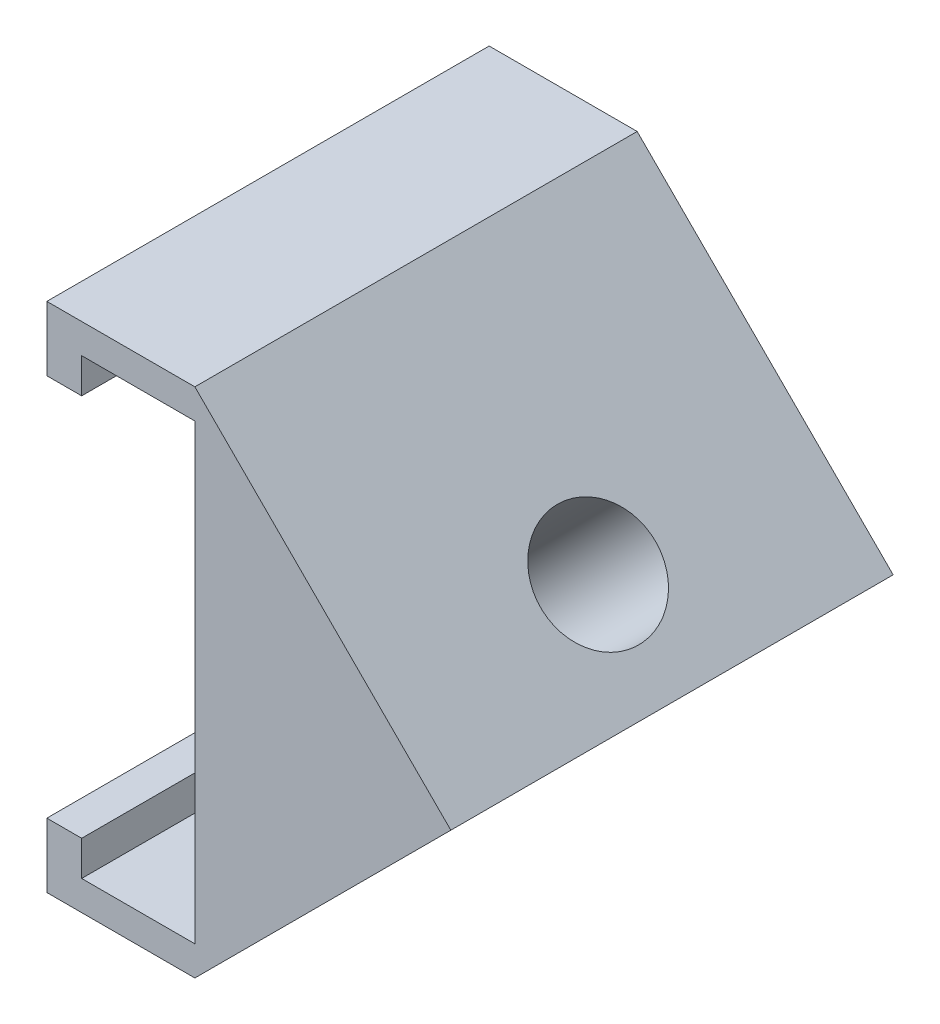
ISO-10303-21;
HEADER;
FILE_DESCRIPTION(('STEP AP214'),'2;1');
FILE_NAME('part.step','',(''),(''),'','','');
FILE_SCHEMA(('AUTOMOTIVE_DESIGN { 1 0 10303 214 1 1 1 1 }'));
ENDSEC;
DATA;
#1=APPLICATION_CONTEXT('core data for automotive mechanical design processes');
#2=APPLICATION_PROTOCOL_DEFINITION('international standard','automotive_design',2000,#1);
#3=PRODUCT_CONTEXT('',#1,'mechanical');
#4=PRODUCT('Part','Part','',(#3));
#5=PRODUCT_RELATED_PRODUCT_CATEGORY('part','',(#4));
#6=PRODUCT_DEFINITION_FORMATION('','',#4);
#7=PRODUCT_DEFINITION_CONTEXT('part definition',#1,'design');
#8=PRODUCT_DEFINITION('design','',#6,#7);
#9=PRODUCT_DEFINITION_SHAPE('','',#8);
#10=(LENGTH_UNIT() NAMED_UNIT(*) SI_UNIT(.MILLI.,.METRE.));
#11=(NAMED_UNIT(*) PLANE_ANGLE_UNIT() SI_UNIT($,.RADIAN.));
#12=(NAMED_UNIT(*) SI_UNIT($,.STERADIAN.) SOLID_ANGLE_UNIT());
#13=UNCERTAINTY_MEASURE_WITH_UNIT(LENGTH_MEASURE(1.E-05),#10,'distance_accuracy_value','');
#14=(GEOMETRIC_REPRESENTATION_CONTEXT(3) GLOBAL_UNCERTAINTY_ASSIGNED_CONTEXT((#13)) GLOBAL_UNIT_ASSIGNED_CONTEXT((#10,
#11,#12)) REPRESENTATION_CONTEXT('',''));
#15=CARTESIAN_POINT('',(0.,0.,0.));
#16=DIRECTION('',(0.,0.,1.));
#17=DIRECTION('',(1.,0.,0.));
#18=AXIS2_PLACEMENT_3D('',#15,#16,#17);
#19=CARTESIAN_POINT('',(0.,0.,12.7));
#20=DIRECTION('',(-0.707106781186522,0.707106781186573,0.));
#21=DIRECTION('',(-0.707106781186573,-0.707106781186522,0.));
#22=AXIS2_PLACEMENT_3D('',#19,#20,#21);
#23=PLANE('',#22);
#24=DIRECTION('',(0.707106781186573,0.707106781186522,0.));
#25=VECTOR('',#24,1.);
#26=CARTESIAN_POINT('',(0.,0.,0.));
#27=LINE('',#26,#25);
#28=CARTESIAN_POINT('',(-7.35,-7.34999999999948,0.));
#29=VERTEX_POINT('',#28);
#30=CARTESIAN_POINT('',(0.,0.,0.));
#31=VERTEX_POINT('',#30);
#32=EDGE_CURVE('E170',#29,#31,#27,.T.);
#33=ORIENTED_EDGE('',*,*,#32,.T.);
#34=DIRECTION('',(0.,0.,-1.));
#35=VECTOR('',#34,1.);
#36=CARTESIAN_POINT('',(0.,0.,12.7));
#37=LINE('',#36,#35);
#38=CARTESIAN_POINT('',(0.,0.,12.7));
#39=VERTEX_POINT('',#38);
#40=EDGE_CURVE('E11',#39,#31,#37,.T.);
#41=ORIENTED_EDGE('',*,*,#40,.F.);
#42=DIRECTION('',(0.707106781186573,0.707106781186522,0.));
#43=VECTOR('',#42,1.);
#44=CARTESIAN_POINT('',(0.,0.,12.7));
#45=LINE('',#44,#43);
#46=CARTESIAN_POINT('',(-7.35,-7.34999999999948,12.7));
#47=VERTEX_POINT('',#46);
#48=EDGE_CURVE('E209',#47,#39,#45,.T.);
#49=ORIENTED_EDGE('',*,*,#48,.F.);
#50=DIRECTION('',(0.,0.,-1.));
#51=VECTOR('',#50,1.);
#52=CARTESIAN_POINT('',(-7.35,-7.34999999999948,12.7));
#53=LINE('',#52,#51);
#54=EDGE_CURVE('E166',#47,#29,#53,.T.);
#55=ORIENTED_EDGE('',*,*,#54,.T.);
#56=EDGE_LOOP('',(#33,#41,#49,#55));
#57=FACE_BOUND('',#56,.T.);
#58=ADVANCED_FACE('F39',(#57),#23,.F.);
#59=CARTESIAN_POINT('',(-7.35,7.35000000000052,12.7));
#60=DIRECTION('',(-0.707106781186573,-0.707106781186523,0.));
#61=DIRECTION('',(0.707106781186523,-0.707106781186573,0.));
#62=AXIS2_PLACEMENT_3D('',#59,#60,#61);
#63=PLANE('',#62);
#64=CARTESIAN_POINT('',(-2.12132034355957,2.12132034355972,6.35));
#65=DIRECTION('',(0.707106781186572,0.707106781186523,0.));
#66=DIRECTION('',(-0.707106781186523,0.707106781186572,0.));
#67=AXIS2_PLACEMENT_3D('',#64,#65,#66);
#68=CIRCLE('',#67,1.65);
#69=CARTESIAN_POINT('',(-3.28804653251733,3.28804653251756,6.35));
#70=VERTEX_POINT('',#69);
#71=EDGE_CURVE('E400',#70,#70,#68,.T.);
#72=ORIENTED_EDGE('',*,*,#71,.F.);
#73=EDGE_LOOP('',(#72));
#74=FACE_BOUND('',#73,.T.);
#75=DIRECTION('',(-0.707106781186522,0.707106781186572,0.));
#76=VECTOR('',#75,1.);
#77=CARTESIAN_POINT('',(-7.35,7.35000000000052,0.));
#78=LINE('',#77,#76);
#79=CARTESIAN_POINT('',(-7.35,7.35000000000052,0.));
#80=VERTEX_POINT('',#79);
#81=EDGE_CURVE('E174',#31,#80,#78,.T.);
#82=ORIENTED_EDGE('',*,*,#81,.T.);
#83=DIRECTION('',(0.,0.,-1.));
#84=VECTOR('',#83,1.);
#85=CARTESIAN_POINT('',(-7.35,7.35000000000052,12.7));
#86=LINE('',#85,#84);
#87=CARTESIAN_POINT('',(-7.35,7.35000000000052,12.7));
#88=VERTEX_POINT('',#87);
#89=EDGE_CURVE('E48',#88,#80,#86,.T.);
#90=ORIENTED_EDGE('',*,*,#89,.F.);
#91=DIRECTION('',(-0.707106781186522,0.707106781186572,0.));
#92=VECTOR('',#91,1.);
#93=CARTESIAN_POINT('',(-7.35,7.35000000000052,12.7));
#94=LINE('',#93,#92);
#95=EDGE_CURVE('E113',#39,#88,#94,.T.);
#96=ORIENTED_EDGE('',*,*,#95,.F.);
#97=ORIENTED_EDGE('',*,*,#40,.T.);
#98=EDGE_LOOP('',(#82,#90,#96,#97));
#99=FACE_BOUND('',#98,.T.);
#100=ADVANCED_FACE('F309',(#74,#99),#63,.F.);
#101=CARTESIAN_POINT('',(-11.6,7.35000000000052,12.7));
#102=DIRECTION('',(0.,-1.,0.));
#103=DIRECTION('',(1.,0.,0.));
#104=AXIS2_PLACEMENT_3D('',#101,#102,#103);
#105=PLANE('',#104);
#106=DIRECTION('',(-1.,0.,0.));
#107=VECTOR('',#106,1.);
#108=CARTESIAN_POINT('',(-11.6,7.35000000000052,0.));
#109=LINE('',#108,#107);
#110=CARTESIAN_POINT('',(-11.6,7.35000000000052,0.));
#111=VERTEX_POINT('',#110);
#112=EDGE_CURVE('E178',#80,#111,#109,.T.);
#113=ORIENTED_EDGE('',*,*,#112,.T.);
#114=DIRECTION('',(0.,0.,-1.));
#115=VECTOR('',#114,1.);
#116=CARTESIAN_POINT('',(-11.6,7.35000000000052,12.7));
#117=LINE('',#116,#115);
#118=CARTESIAN_POINT('',(-11.6,7.35000000000052,12.7));
#119=VERTEX_POINT('',#118);
#120=EDGE_CURVE('E240',#119,#111,#117,.T.);
#121=ORIENTED_EDGE('',*,*,#120,.F.);
#122=DIRECTION('',(-1.,0.,0.));
#123=VECTOR('',#122,1.);
#124=CARTESIAN_POINT('',(-11.6,7.35000000000052,12.7));
#125=LINE('',#124,#123);
#126=EDGE_CURVE('E250',#88,#119,#125,.T.);
#127=ORIENTED_EDGE('',*,*,#126,.F.);
#128=ORIENTED_EDGE('',*,*,#89,.T.);
#129=EDGE_LOOP('',(#113,#121,#127,#128));
#130=FACE_BOUND('',#129,.T.);
#131=ADVANCED_FACE('F248',(#130),#105,.F.);
#132=CARTESIAN_POINT('',(-11.6,6.5,12.7));
#133=DIRECTION('',(1.,0.,0.));
#134=DIRECTION('',(0.,1.,0.));
#135=AXIS2_PLACEMENT_3D('',#132,#133,#134);
#136=PLANE('',#135);
#137=DIRECTION('',(0.,-1.,0.));
#138=VECTOR('',#137,1.);
#139=CARTESIAN_POINT('',(-11.6,6.5,0.));
#140=LINE('',#139,#138);
#141=CARTESIAN_POINT('',(-11.6,5.5,0.));
#142=VERTEX_POINT('',#141);
#143=EDGE_CURVE('E182',#111,#142,#140,.T.);
#144=ORIENTED_EDGE('',*,*,#143,.T.);
#145=DIRECTION('',(0.,0.,-1.));
#146=VECTOR('',#145,1.);
#147=CARTESIAN_POINT('',(-11.6,5.5,12.7));
#148=LINE('',#147,#146);
#149=CARTESIAN_POINT('',(-11.6,5.5,12.7));
#150=VERTEX_POINT('',#149);
#151=EDGE_CURVE('E236',#150,#142,#148,.T.);
#152=ORIENTED_EDGE('',*,*,#151,.F.);
#153=DIRECTION('',(0.,-1.,0.));
#154=VECTOR('',#153,1.);
#155=CARTESIAN_POINT('',(-11.6,7.35000000000052,12.7));
#156=LINE('',#155,#154);
#157=EDGE_CURVE('E268',#119,#150,#156,.T.);
#158=ORIENTED_EDGE('',*,*,#157,.F.);
#159=ORIENTED_EDGE('',*,*,#120,.T.);
#160=EDGE_LOOP('',(#144,#152,#158,#159));
#161=FACE_BOUND('',#160,.T.);
#162=ADVANCED_FACE('F258',(#161),#136,.F.);
#163=CARTESIAN_POINT('',(-11.6,5.5,12.7));
#164=DIRECTION('',(0.,1.,0.));
#165=DIRECTION('',(-1.,0.,0.));
#166=AXIS2_PLACEMENT_3D('',#163,#164,#165);
#167=PLANE('',#166);
#168=DIRECTION('',(1.,0.,0.));
#169=VECTOR('',#168,1.);
#170=CARTESIAN_POINT('',(-11.6,5.5,0.));
#171=LINE('',#170,#169);
#172=CARTESIAN_POINT('',(-10.6,5.5,0.));
#173=VERTEX_POINT('',#172);
#174=EDGE_CURVE('E185',#142,#173,#171,.T.);
#175=ORIENTED_EDGE('',*,*,#174,.T.);
#176=DIRECTION('',(0.,0.,-1.));
#177=VECTOR('',#176,1.);
#178=CARTESIAN_POINT('',(-10.6,5.5,12.7));
#179=LINE('',#178,#177);
#180=CARTESIAN_POINT('',(-10.6,5.5,12.7));
#181=VERTEX_POINT('',#180);
#182=EDGE_CURVE('E232',#181,#173,#179,.T.);
#183=ORIENTED_EDGE('',*,*,#182,.F.);
#184=DIRECTION('',(1.,0.,0.));
#185=VECTOR('',#184,1.);
#186=CARTESIAN_POINT('',(-11.6,5.5,12.7));
#187=LINE('',#186,#185);
#188=EDGE_CURVE('E264',#150,#181,#187,.T.);
#189=ORIENTED_EDGE('',*,*,#188,.F.);
#190=ORIENTED_EDGE('',*,*,#151,.T.);
#191=EDGE_LOOP('',(#175,#183,#189,#190));
#192=FACE_BOUND('',#191,.T.);
#193=ADVANCED_FACE('F262',(#192),#167,.F.);
#194=CARTESIAN_POINT('',(-10.6,6.5,12.7));
#195=DIRECTION('',(-1.,0.,0.));
#196=DIRECTION('',(0.,0.,1.));
#197=AXIS2_PLACEMENT_3D('',#194,#195,#196);
#198=PLANE('',#197);
#199=DIRECTION('',(0.,1.,0.));
#200=VECTOR('',#199,1.);
#201=CARTESIAN_POINT('',(-10.6,6.5,0.));
#202=LINE('',#201,#200);
#203=CARTESIAN_POINT('',(-10.6,6.5,0.));
#204=VERTEX_POINT('',#203);
#205=EDGE_CURVE('E188',#173,#204,#202,.T.);
#206=ORIENTED_EDGE('',*,*,#205,.T.);
#207=DIRECTION('',(0.,0.,-1.));
#208=VECTOR('',#207,1.);
#209=CARTESIAN_POINT('',(-10.6,6.5,12.7));
#210=LINE('',#209,#208);
#211=CARTESIAN_POINT('',(-10.6,6.5,12.7));
#212=VERTEX_POINT('',#211);
#213=EDGE_CURVE('E228',#212,#204,#210,.T.);
#214=ORIENTED_EDGE('',*,*,#213,.F.);
#215=DIRECTION('',(0.,1.,0.));
#216=VECTOR('',#215,1.);
#217=CARTESIAN_POINT('',(-10.6,6.5,12.7));
#218=LINE('',#217,#216);
#219=EDGE_CURVE('E267',#181,#212,#218,.T.);
#220=ORIENTED_EDGE('',*,*,#219,.F.);
#221=ORIENTED_EDGE('',*,*,#182,.T.);
#222=EDGE_LOOP('',(#206,#214,#220,#221));
#223=FACE_BOUND('',#222,.T.);
#224=ADVANCED_FACE('F324',(#223),#198,.F.);
#225=CARTESIAN_POINT('',(-10.6,6.5,12.7));
#226=DIRECTION('',(0.,1.,0.));
#227=DIRECTION('',(-1.,0.,0.));
#228=AXIS2_PLACEMENT_3D('',#225,#226,#227);
#229=PLANE('',#228);
#230=DIRECTION('',(1.,0.,0.));
#231=VECTOR('',#230,1.);
#232=CARTESIAN_POINT('',(-10.6,6.5,0.));
#233=LINE('',#232,#231);
#234=CARTESIAN_POINT('',(-7.35,6.5,0.));
#235=VERTEX_POINT('',#234);
#236=EDGE_CURVE('E191',#204,#235,#233,.T.);
#237=ORIENTED_EDGE('',*,*,#236,.T.);
#238=DIRECTION('',(0.,0.,-1.));
#239=VECTOR('',#238,1.);
#240=CARTESIAN_POINT('',(-7.35,6.5,12.7));
#241=LINE('',#240,#239);
#242=CARTESIAN_POINT('',(-7.35,6.5,12.7));
#243=VERTEX_POINT('',#242);
#244=EDGE_CURVE('E224',#243,#235,#241,.T.);
#245=ORIENTED_EDGE('',*,*,#244,.F.);
#246=DIRECTION('',(1.,0.,0.));
#247=VECTOR('',#246,1.);
#248=CARTESIAN_POINT('',(-10.6,6.5,12.7));
#249=LINE('',#248,#247);
#250=EDGE_CURVE('E272',#212,#243,#249,.T.);
#251=ORIENTED_EDGE('',*,*,#250,.F.);
#252=ORIENTED_EDGE('',*,*,#213,.T.);
#253=EDGE_LOOP('',(#237,#245,#251,#252));
#254=FACE_BOUND('',#253,.T.);
#255=ADVANCED_FACE('F327',(#254),#229,.F.);
#256=CARTESIAN_POINT('',(-7.35,6.5,12.7));
#257=DIRECTION('',(1.,0.,0.));
#258=DIRECTION('',(0.,1.,0.));
#259=AXIS2_PLACEMENT_3D('',#256,#257,#258);
#260=PLANE('',#259);
#261=DIRECTION('',(0.,-1.,0.));
#262=VECTOR('',#261,1.);
#263=CARTESIAN_POINT('',(-7.35,6.5,0.));
#264=LINE('',#263,#262);
#265=CARTESIAN_POINT('',(-7.35,-6.5,0.));
#266=VERTEX_POINT('',#265);
#267=EDGE_CURVE('E194',#235,#266,#264,.T.);
#268=ORIENTED_EDGE('',*,*,#267,.T.);
#269=DIRECTION('',(0.,0.,-1.));
#270=VECTOR('',#269,1.);
#271=CARTESIAN_POINT('',(-7.35,-6.5,12.7));
#272=LINE('',#271,#270);
#273=CARTESIAN_POINT('',(-7.35,-6.5,12.7));
#274=VERTEX_POINT('',#273);
#275=EDGE_CURVE('E220',#274,#266,#272,.T.);
#276=ORIENTED_EDGE('',*,*,#275,.F.);
#277=DIRECTION('',(0.,-1.,0.));
#278=VECTOR('',#277,1.);
#279=CARTESIAN_POINT('',(-7.35,6.5,12.7));
#280=LINE('',#279,#278);
#281=EDGE_CURVE('E279',#243,#274,#280,.T.);
#282=ORIENTED_EDGE('',*,*,#281,.F.);
#283=ORIENTED_EDGE('',*,*,#244,.T.);
#284=EDGE_LOOP('',(#268,#276,#282,#283));
#285=FACE_BOUND('',#284,.T.);
#286=ADVANCED_FACE('F331',(#285),#260,.F.);
#287=CARTESIAN_POINT('',(-10.6,-6.5,12.7));
#288=DIRECTION('',(0.,-1.,0.));
#289=DIRECTION('',(1.,0.,0.));
#290=AXIS2_PLACEMENT_3D('',#287,#288,#289);
#291=PLANE('',#290);
#292=DIRECTION('',(-1.,0.,0.));
#293=VECTOR('',#292,1.);
#294=CARTESIAN_POINT('',(-10.6,-6.5,0.));
#295=LINE('',#294,#293);
#296=CARTESIAN_POINT('',(-10.6,-6.5,0.));
#297=VERTEX_POINT('',#296);
#298=EDGE_CURVE('E197',#266,#297,#295,.T.);
#299=ORIENTED_EDGE('',*,*,#298,.T.);
#300=DIRECTION('',(0.,0.,-1.));
#301=VECTOR('',#300,1.);
#302=CARTESIAN_POINT('',(-10.6,-6.5,12.7));
#303=LINE('',#302,#301);
#304=CARTESIAN_POINT('',(-10.6,-6.5,12.7));
#305=VERTEX_POINT('',#304);
#306=EDGE_CURVE('E216',#305,#297,#303,.T.);
#307=ORIENTED_EDGE('',*,*,#306,.F.);
#308=DIRECTION('',(-1.,0.,0.));
#309=VECTOR('',#308,1.);
#310=CARTESIAN_POINT('',(-10.6,-6.5,12.7));
#311=LINE('',#310,#309);
#312=EDGE_CURVE('E282',#274,#305,#311,.T.);
#313=ORIENTED_EDGE('',*,*,#312,.F.);
#314=ORIENTED_EDGE('',*,*,#275,.T.);
#315=EDGE_LOOP('',(#299,#307,#313,#314));
#316=FACE_BOUND('',#315,.T.);
#317=ADVANCED_FACE('F290',(#316),#291,.F.);
#318=CARTESIAN_POINT('',(-10.6,-6.5,12.7));
#319=DIRECTION('',(-1.,0.,0.));
#320=DIRECTION('',(0.,0.,1.));
#321=AXIS2_PLACEMENT_3D('',#318,#319,#320);
#322=PLANE('',#321);
#323=DIRECTION('',(0.,1.,0.));
#324=VECTOR('',#323,1.);
#325=CARTESIAN_POINT('',(-10.6,-6.5,0.));
#326=LINE('',#325,#324);
#327=CARTESIAN_POINT('',(-10.6,-5.5,0.));
#328=VERTEX_POINT('',#327);
#329=EDGE_CURVE('E200',#297,#328,#326,.T.);
#330=ORIENTED_EDGE('',*,*,#329,.T.);
#331=DIRECTION('',(0.,0.,-1.));
#332=VECTOR('',#331,1.);
#333=CARTESIAN_POINT('',(-10.6,-5.5,12.7));
#334=LINE('',#333,#332);
#335=CARTESIAN_POINT('',(-10.6,-5.5,12.7));
#336=VERTEX_POINT('',#335);
#337=EDGE_CURVE('E159',#336,#328,#334,.T.);
#338=ORIENTED_EDGE('',*,*,#337,.F.);
#339=DIRECTION('',(0.,1.,0.));
#340=VECTOR('',#339,1.);
#341=CARTESIAN_POINT('',(-10.6,-6.5,12.7));
#342=LINE('',#341,#340);
#343=EDGE_CURVE('E147',#305,#336,#342,.T.);
#344=ORIENTED_EDGE('',*,*,#343,.F.);
#345=ORIENTED_EDGE('',*,*,#306,.T.);
#346=EDGE_LOOP('',(#330,#338,#344,#345));
#347=FACE_BOUND('',#346,.T.);
#348=ADVANCED_FACE('F294',(#347),#322,.F.);
#349=CARTESIAN_POINT('',(-11.6,-5.5,12.7));
#350=DIRECTION('',(0.,-1.,0.));
#351=DIRECTION('',(0.,0.,-1.));
#352=AXIS2_PLACEMENT_3D('',#349,#350,#351);
#353=PLANE('',#352);
#354=DIRECTION('',(-1.,0.,0.));
#355=VECTOR('',#354,1.);
#356=CARTESIAN_POINT('',(-11.6,-5.5,0.));
#357=LINE('',#356,#355);
#358=CARTESIAN_POINT('',(-11.6,-5.5,0.));
#359=VERTEX_POINT('',#358);
#360=EDGE_CURVE('E157',#328,#359,#357,.T.);
#361=ORIENTED_EDGE('',*,*,#360,.T.);
#362=DIRECTION('',(0.,0.,-1.));
#363=VECTOR('',#362,1.);
#364=CARTESIAN_POINT('',(-11.6,-5.5,12.7));
#365=LINE('',#364,#363);
#366=CARTESIAN_POINT('',(-11.6,-5.5,12.7));
#367=VERTEX_POINT('',#366);
#368=EDGE_CURVE('E154',#367,#359,#365,.T.);
#369=ORIENTED_EDGE('',*,*,#368,.F.);
#370=DIRECTION('',(-1.,0.,0.));
#371=VECTOR('',#370,1.);
#372=CARTESIAN_POINT('',(-11.6,-5.5,12.7));
#373=LINE('',#372,#371);
#374=EDGE_CURVE('E141',#336,#367,#373,.T.);
#375=ORIENTED_EDGE('',*,*,#374,.F.);
#376=ORIENTED_EDGE('',*,*,#337,.T.);
#377=EDGE_LOOP('',(#361,#369,#375,#376));
#378=FACE_BOUND('',#377,.T.);
#379=ADVANCED_FACE('F155',(#378),#353,.F.);
#380=CARTESIAN_POINT('',(-11.6,-6.5,12.7));
#381=DIRECTION('',(1.,0.,0.));
#382=DIRECTION('',(0.,1.,0.));
#383=AXIS2_PLACEMENT_3D('',#380,#381,#382);
#384=PLANE('',#383);
#385=DIRECTION('',(0.,-1.,0.));
#386=VECTOR('',#385,1.);
#387=CARTESIAN_POINT('',(-11.6,-6.5,0.));
#388=LINE('',#387,#386);
#389=CARTESIAN_POINT('',(-11.6,-7.34999999999948,0.));
#390=VERTEX_POINT('',#389);
#391=EDGE_CURVE('E99',#359,#390,#388,.T.);
#392=ORIENTED_EDGE('',*,*,#391,.T.);
#393=DIRECTION('',(0.,0.,-1.));
#394=VECTOR('',#393,1.);
#395=CARTESIAN_POINT('',(-11.6,-7.34999999999948,12.7));
#396=LINE('',#395,#394);
#397=CARTESIAN_POINT('',(-11.6,-7.34999999999948,12.7));
#398=VERTEX_POINT('',#397);
#399=EDGE_CURVE('E160',#398,#390,#396,.T.);
#400=ORIENTED_EDGE('',*,*,#399,.F.);
#401=DIRECTION('',(0.,-1.,0.));
#402=VECTOR('',#401,1.);
#403=CARTESIAN_POINT('',(-11.6,-6.5,12.7));
#404=LINE('',#403,#402);
#405=EDGE_CURVE('E145',#367,#398,#404,.T.);
#406=ORIENTED_EDGE('',*,*,#405,.F.);
#407=ORIENTED_EDGE('',*,*,#368,.T.);
#408=EDGE_LOOP('',(#392,#400,#406,#407));
#409=FACE_BOUND('',#408,.T.);
#410=ADVANCED_FACE('F162',(#409),#384,.F.);
#411=CARTESIAN_POINT('',(-11.6,-7.34999999999948,12.7));
#412=DIRECTION('',(0.,1.,0.));
#413=DIRECTION('',(0.,0.,1.));
#414=AXIS2_PLACEMENT_3D('',#411,#412,#413);
#415=PLANE('',#414);
#416=DIRECTION('',(1.,0.,0.));
#417=VECTOR('',#416,1.);
#418=CARTESIAN_POINT('',(-11.6,-7.34999999999948,0.));
#419=LINE('',#418,#417);
#420=EDGE_CURVE('E105',#390,#29,#419,.T.);
#421=ORIENTED_EDGE('',*,*,#420,.T.);
#422=ORIENTED_EDGE('',*,*,#54,.F.);
#423=DIRECTION('',(1.,0.,0.));
#424=VECTOR('',#423,1.);
#425=CARTESIAN_POINT('',(-11.6,-7.34999999999948,12.7));
#426=LINE('',#425,#424);
#427=EDGE_CURVE('E56',#398,#47,#426,.T.);
#428=ORIENTED_EDGE('',*,*,#427,.F.);
#429=ORIENTED_EDGE('',*,*,#399,.T.);
#430=EDGE_LOOP('',(#421,#422,#428,#429));
#431=FACE_BOUND('',#430,.T.);
#432=ADVANCED_FACE('F298',(#431),#415,.F.);
#433=CARTESIAN_POINT('',(0.,0.,12.7));
#434=DIRECTION('',(0.,0.,1.));
#435=DIRECTION('',(1.,0.,0.));
#436=AXIS2_PLACEMENT_3D('',#433,#434,#435);
#437=PLANE('',#436);
#438=ORIENTED_EDGE('',*,*,#48,.T.);
#439=ORIENTED_EDGE('',*,*,#95,.T.);
#440=ORIENTED_EDGE('',*,*,#126,.T.);
#441=ORIENTED_EDGE('',*,*,#157,.T.);
#442=ORIENTED_EDGE('',*,*,#188,.T.);
#443=ORIENTED_EDGE('',*,*,#219,.T.);
#444=ORIENTED_EDGE('',*,*,#250,.T.);
#445=ORIENTED_EDGE('',*,*,#281,.T.);
#446=ORIENTED_EDGE('',*,*,#312,.T.);
#447=ORIENTED_EDGE('',*,*,#343,.T.);
#448=ORIENTED_EDGE('',*,*,#374,.T.);
#449=ORIENTED_EDGE('',*,*,#405,.T.);
#450=ORIENTED_EDGE('',*,*,#427,.T.);
#451=EDGE_LOOP('',(#438,#439,#440,#441,#442,#443,#444,#445,#446,#447,#448,#449,#450));
#452=FACE_BOUND('',#451,.T.);
#453=ADVANCED_FACE('F143',(#452),#437,.T.);
#454=CARTESIAN_POINT('',(0.,0.,0.));
#455=DIRECTION('',(0.,0.,1.));
#456=DIRECTION('',(1.,0.,0.));
#457=AXIS2_PLACEMENT_3D('',#454,#455,#456);
#458=PLANE('',#457);
#459=ORIENTED_EDGE('',*,*,#32,.F.);
#460=ORIENTED_EDGE('',*,*,#420,.F.);
#461=ORIENTED_EDGE('',*,*,#391,.F.);
#462=ORIENTED_EDGE('',*,*,#360,.F.);
#463=ORIENTED_EDGE('',*,*,#329,.F.);
#464=ORIENTED_EDGE('',*,*,#298,.F.);
#465=ORIENTED_EDGE('',*,*,#267,.F.);
#466=ORIENTED_EDGE('',*,*,#236,.F.);
#467=ORIENTED_EDGE('',*,*,#205,.F.);
#468=ORIENTED_EDGE('',*,*,#174,.F.);
#469=ORIENTED_EDGE('',*,*,#143,.F.);
#470=ORIENTED_EDGE('',*,*,#112,.F.);
#471=ORIENTED_EDGE('',*,*,#81,.F.);
#472=EDGE_LOOP('',(#459,#460,#461,#462,#463,#464,#465,#466,#467,#468,#469,#470,#471));
#473=FACE_BOUND('',#472,.T.);
#474=ADVANCED_FACE('F253',(#473),#458,.F.);
#475=CARTESIAN_POINT('',(-5.65685424949243,-1.4142135623729,6.35));
#476=DIRECTION('',(0.707106781186572,0.707106781186523,0.));
#477=DIRECTION('',(-0.707106781186523,0.707106781186572,0.));
#478=AXIS2_PLACEMENT_3D('',#475,#476,#477);
#479=CYLINDRICAL_SURFACE('',#478,1.65);
#480=CARTESIAN_POINT('',(-5.65685424949243,-1.4142135623729,6.35));
#481=DIRECTION('',(0.707106781186572,0.707106781186523,0.));
#482=DIRECTION('',(-0.707106781186523,0.707106781186572,0.));
#483=AXIS2_PLACEMENT_3D('',#480,#481,#482);
#484=CIRCLE('',#483,1.65);
#485=CARTESIAN_POINT('',(-6.82358043845019,-0.24748737341505,6.35));
#486=VERTEX_POINT('',#485);
#487=EDGE_CURVE('E175',#486,#486,#484,.T.);
#488=ORIENTED_EDGE('',*,*,#487,.F.);
#489=EDGE_LOOP('',(#488));
#490=FACE_BOUND('',#489,.T.);
#491=ORIENTED_EDGE('',*,*,#71,.T.);
#492=EDGE_LOOP('',(#491));
#493=FACE_BOUND('',#492,.T.);
#494=ADVANCED_FACE('F368',(#490,#493),#479,.F.);
#495=CARTESIAN_POINT('',(-5.65685424949243,-1.4142135623729,6.35));
#496=DIRECTION('',(0.707106781186572,0.707106781186523,0.));
#497=DIRECTION('',(-0.707106781186523,0.707106781186572,0.));
#498=AXIS2_PLACEMENT_3D('',#495,#496,#497);
#499=PLANE('',#498);
#500=ORIENTED_EDGE('',*,*,#487,.T.);
#501=EDGE_LOOP('',(#500));
#502=FACE_BOUND('',#501,.T.);
#503=ADVANCED_FACE('F383',(#502),#499,.T.);
#504=CLOSED_SHELL('',(#58,#100,#131,#162,#193,#224,#255,#286,#317,#348,#379,#410,#432,#453,#474,
#494,#503));
#505=MANIFOLD_SOLID_BREP('B2',#504);
#506=ADVANCED_BREP_SHAPE_REPRESENTATION('',(#18,#505),#14);
#507=SHAPE_DEFINITION_REPRESENTATION(#9,#506);
ENDSEC;
END-ISO-10303-21;
